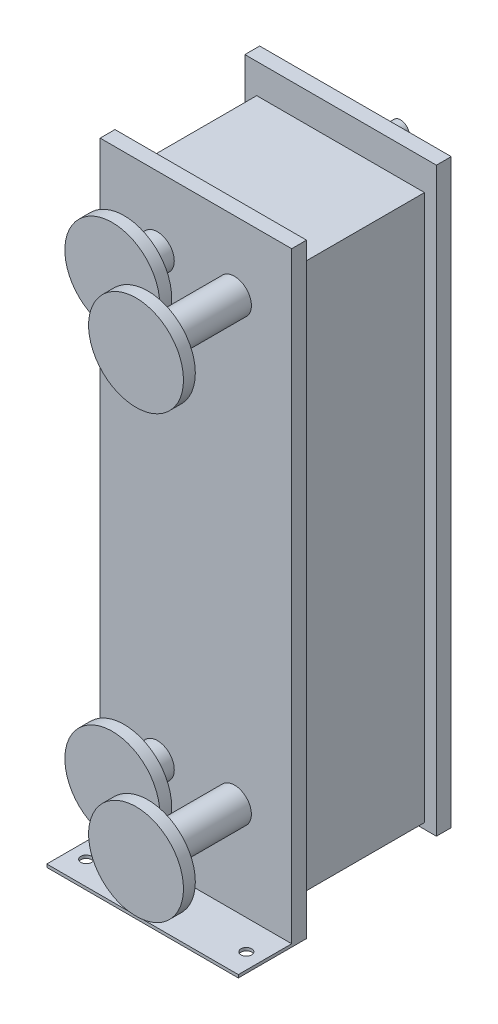
ISO-10303-21;
HEADER;
FILE_DESCRIPTION(('STEP AP214'),'2;1');
FILE_NAME('part.step','',(''),(''),'','','');
FILE_SCHEMA(('AUTOMOTIVE_DESIGN { 1 0 10303 214 1 1 1 1 }'));
ENDSEC;
DATA;
#1=APPLICATION_CONTEXT('core data for automotive mechanical design processes');
#2=APPLICATION_PROTOCOL_DEFINITION('international standard','automotive_design',2000,#1);
#3=PRODUCT_CONTEXT('',#1,'mechanical');
#4=PRODUCT('Part','Part','',(#3));
#5=PRODUCT_RELATED_PRODUCT_CATEGORY('part','',(#4));
#6=PRODUCT_DEFINITION_FORMATION('','',#4);
#7=PRODUCT_DEFINITION_CONTEXT('part definition',#1,'design');
#8=PRODUCT_DEFINITION('design','',#6,#7);
#9=PRODUCT_DEFINITION_SHAPE('','',#8);
#10=(LENGTH_UNIT() NAMED_UNIT(*) SI_UNIT(.MILLI.,.METRE.));
#11=(NAMED_UNIT(*) PLANE_ANGLE_UNIT() SI_UNIT($,.RADIAN.));
#12=(NAMED_UNIT(*) SI_UNIT($,.STERADIAN.) SOLID_ANGLE_UNIT());
#13=UNCERTAINTY_MEASURE_WITH_UNIT(LENGTH_MEASURE(1.E-05),#10,'distance_accuracy_value','');
#14=(GEOMETRIC_REPRESENTATION_CONTEXT(3) GLOBAL_UNCERTAINTY_ASSIGNED_CONTEXT((#13)) GLOBAL_UNIT_ASSIGNED_CONTEXT((#10,
#11,#12)) REPRESENTATION_CONTEXT('',''));
#15=CARTESIAN_POINT('',(0.,0.,0.));
#16=DIRECTION('',(0.,0.,1.));
#17=DIRECTION('',(1.,0.,0.));
#18=AXIS2_PLACEMENT_3D('',#15,#16,#17);
#19=CARTESIAN_POINT('',(65.0000000000001,-350.,101.));
#20=DIRECTION('',(0.,0.,-1.));
#21=DIRECTION('',(-1.,0.,0.));
#22=AXIS2_PLACEMENT_3D('',#19,#20,#21);
#23=CYLINDRICAL_SURFACE('',#22,28.5);
#24=CARTESIAN_POINT('',(65.0000000000001,-350.,25.));
#25=DIRECTION('',(0.,0.,1.));
#26=DIRECTION('',(1.,0.,0.));
#27=AXIS2_PLACEMENT_3D('',#24,#25,#26);
#28=CIRCLE('',#27,28.5);
#29=CARTESIAN_POINT('',(93.5000000000001,-350.,25.));
#30=VERTEX_POINT('',#29);
#31=EDGE_CURVE('E579',#30,#30,#28,.T.);
#32=ORIENTED_EDGE('',*,*,#31,.T.);
#33=EDGE_LOOP('',(#32));
#34=FACE_BOUND('',#33,.T.);
#35=CARTESIAN_POINT('',(65.0000000000001,-350.,171.));
#36=DIRECTION('',(0.,0.,1.));
#37=DIRECTION('',(1.,0.,0.));
#38=AXIS2_PLACEMENT_3D('',#35,#36,#37);
#39=CIRCLE('',#38,28.5);
#40=CARTESIAN_POINT('',(93.5000000000001,-350.,171.));
#41=VERTEX_POINT('',#40);
#42=EDGE_CURVE('E11',#41,#41,#39,.T.);
#43=ORIENTED_EDGE('',*,*,#42,.F.);
#44=EDGE_LOOP('',(#43));
#45=FACE_BOUND('',#44,.T.);
#46=ADVANCED_FACE('F36',(#34,#45),#23,.T.);
#47=CARTESIAN_POINT('',(65.,393.,101.));
#48=DIRECTION('',(0.,0.,-1.));
#49=DIRECTION('',(-1.,0.,0.));
#50=AXIS2_PLACEMENT_3D('',#47,#48,#49);
#51=CYLINDRICAL_SURFACE('',#50,28.5);
#52=CARTESIAN_POINT('',(65.,393.,25.));
#53=DIRECTION('',(0.,0.,1.));
#54=DIRECTION('',(1.,0.,0.));
#55=AXIS2_PLACEMENT_3D('',#52,#53,#54);
#56=CIRCLE('',#55,28.5);
#57=CARTESIAN_POINT('',(93.5,393.,25.));
#58=VERTEX_POINT('',#57);
#59=EDGE_CURVE('E578',#58,#58,#56,.T.);
#60=ORIENTED_EDGE('',*,*,#59,.T.);
#61=EDGE_LOOP('',(#60));
#62=FACE_BOUND('',#61,.T.);
#63=CARTESIAN_POINT('',(65.,393.,171.));
#64=DIRECTION('',(0.,0.,1.));
#65=DIRECTION('',(1.,0.,0.));
#66=AXIS2_PLACEMENT_3D('',#63,#64,#65);
#67=CIRCLE('',#66,28.5);
#68=CARTESIAN_POINT('',(93.5,393.,171.));
#69=VERTEX_POINT('',#68);
#70=EDGE_CURVE('E44',#69,#69,#67,.T.);
#71=ORIENTED_EDGE('',*,*,#70,.F.);
#72=EDGE_LOOP('',(#71));
#73=FACE_BOUND('',#72,.T.);
#74=ADVANCED_FACE('F302',(#62,#73),#51,.T.);
#75=CARTESIAN_POINT('',(-65.0000000000001,-350.,101.));
#76=DIRECTION('',(0.,0.,-1.));
#77=DIRECTION('',(-1.,0.,0.));
#78=AXIS2_PLACEMENT_3D('',#75,#76,#77);
#79=CYLINDRICAL_SURFACE('',#78,28.5);
#80=CARTESIAN_POINT('',(-65.0000000000001,-350.,25.));
#81=DIRECTION('',(0.,0.,1.));
#82=DIRECTION('',(1.,0.,0.));
#83=AXIS2_PLACEMENT_3D('',#80,#81,#82);
#84=CIRCLE('',#83,28.5);
#85=CARTESIAN_POINT('',(-36.5000000000001,-350.,25.));
#86=VERTEX_POINT('',#85);
#87=EDGE_CURVE('E590',#86,#86,#84,.T.);
#88=ORIENTED_EDGE('',*,*,#87,.T.);
#89=EDGE_LOOP('',(#88));
#90=FACE_BOUND('',#89,.T.);
#91=CARTESIAN_POINT('',(-65.0000000000001,-350.,81.));
#92=DIRECTION('',(0.,0.,1.));
#93=DIRECTION('',(1.,0.,0.));
#94=AXIS2_PLACEMENT_3D('',#91,#92,#93);
#95=CIRCLE('',#94,28.5);
#96=CARTESIAN_POINT('',(-36.5000000000001,-350.,81.));
#97=VERTEX_POINT('',#96);
#98=EDGE_CURVE('E294',#97,#97,#95,.T.);
#99=ORIENTED_EDGE('',*,*,#98,.F.);
#100=EDGE_LOOP('',(#99));
#101=FACE_BOUND('',#100,.T.);
#102=ADVANCED_FACE('F304',(#90,#101),#79,.T.);
#103=CARTESIAN_POINT('',(-65.,393.,101.));
#104=DIRECTION('',(0.,0.,-1.));
#105=DIRECTION('',(-1.,0.,0.));
#106=AXIS2_PLACEMENT_3D('',#103,#104,#105);
#107=CYLINDRICAL_SURFACE('',#106,28.5);
#108=CARTESIAN_POINT('',(-65.,393.,25.));
#109=DIRECTION('',(0.,0.,1.));
#110=DIRECTION('',(1.,0.,0.));
#111=AXIS2_PLACEMENT_3D('',#108,#109,#110);
#112=CIRCLE('',#111,28.5);
#113=CARTESIAN_POINT('',(-36.5,393.,25.));
#114=VERTEX_POINT('',#113);
#115=EDGE_CURVE('E576',#114,#114,#112,.T.);
#116=ORIENTED_EDGE('',*,*,#115,.T.);
#117=EDGE_LOOP('',(#116));
#118=FACE_BOUND('',#117,.T.);
#119=CARTESIAN_POINT('',(-65.,393.,81.));
#120=DIRECTION('',(0.,0.,1.));
#121=DIRECTION('',(1.,0.,0.));
#122=AXIS2_PLACEMENT_3D('',#119,#120,#121);
#123=CIRCLE('',#122,28.5);
#124=CARTESIAN_POINT('',(-36.5,393.,81.));
#125=VERTEX_POINT('',#124);
#126=EDGE_CURVE('E291',#125,#125,#123,.T.);
#127=ORIENTED_EDGE('',*,*,#126,.F.);
#128=EDGE_LOOP('',(#127));
#129=FACE_BOUND('',#128,.T.);
#130=ADVANCED_FACE('F311',(#118,#129),#107,.T.);
#131=CARTESIAN_POINT('',(161.5,-510.,25.));
#132=DIRECTION('',(0.,0.,1.));
#133=DIRECTION('',(1.,0.,0.));
#134=AXIS2_PLACEMENT_3D('',#131,#132,#133);
#135=PLANE('',#134);
#136=ORIENTED_EDGE('',*,*,#31,.F.);
#137=EDGE_LOOP('',(#136));
#138=FACE_BOUND('',#137,.T.);
#139=ORIENTED_EDGE('',*,*,#87,.F.);
#140=EDGE_LOOP('',(#139));
#141=FACE_BOUND('',#140,.T.);
#142=DIRECTION('',(0.,-1.,0.));
#143=VECTOR('',#142,1.);
#144=CARTESIAN_POINT('',(-161.5,510.,25.));
#145=LINE('',#144,#143);
#146=CARTESIAN_POINT('',(-161.5,510.,25.));
#147=VERTEX_POINT('',#146);
#148=CARTESIAN_POINT('',(-161.5,-505.,25.));
#149=VERTEX_POINT('',#148);
#150=EDGE_CURVE('E281',#147,#149,#145,.T.);
#151=ORIENTED_EDGE('',*,*,#150,.T.);
#152=DIRECTION('',(1.,0.,0.));
#153=VECTOR('',#152,1.);
#154=CARTESIAN_POINT('',(-161.5,-505.,25.));
#155=LINE('',#154,#153);
#156=CARTESIAN_POINT('',(161.5,-505.,25.));
#157=VERTEX_POINT('',#156);
#158=EDGE_CURVE('E277',#149,#157,#155,.T.);
#159=ORIENTED_EDGE('',*,*,#158,.T.);
#160=DIRECTION('',(0.,1.,0.));
#161=VECTOR('',#160,1.);
#162=CARTESIAN_POINT('',(161.5,510.,25.));
#163=LINE('',#162,#161);
#164=CARTESIAN_POINT('',(161.5,510.,25.));
#165=VERTEX_POINT('',#164);
#166=EDGE_CURVE('E477',#157,#165,#163,.T.);
#167=ORIENTED_EDGE('',*,*,#166,.T.);
#168=DIRECTION('',(-1.,0.,0.));
#169=VECTOR('',#168,1.);
#170=CARTESIAN_POINT('',(-161.5,510.,25.));
#171=LINE('',#170,#169);
#172=EDGE_CURVE('E486',#165,#147,#171,.T.);
#173=ORIENTED_EDGE('',*,*,#172,.T.);
#174=EDGE_LOOP('',(#151,#159,#167,#173));
#175=FACE_BOUND('',#174,.T.);
#176=ORIENTED_EDGE('',*,*,#115,.F.);
#177=EDGE_LOOP('',(#176));
#178=FACE_BOUND('',#177,.T.);
#179=ORIENTED_EDGE('',*,*,#59,.F.);
#180=EDGE_LOOP('',(#179));
#181=FACE_BOUND('',#180,.T.);
#182=ADVANCED_FACE('F328',(#138,#141,#175,#178,#181),#135,.T.);
#183=CARTESIAN_POINT('',(161.5,-470.,-244.));
#184=DIRECTION('',(0.,0.,-1.));
#185=DIRECTION('',(-1.,0.,0.));
#186=AXIS2_PLACEMENT_3D('',#183,#184,#185);
#187=PLANE('',#186);
#188=CARTESIAN_POINT('',(-1.12885274259759E-13,-420.,-244.));
#189=DIRECTION('',(0.,0.,-1.));
#190=DIRECTION('',(-1.,0.,0.));
#191=AXIS2_PLACEMENT_3D('',#188,#189,#190);
#192=CIRCLE('',#191,15.);
#193=CARTESIAN_POINT('',(-15.0000000000001,-420.,-244.));
#194=VERTEX_POINT('',#193);
#195=EDGE_CURVE('E253',#194,#194,#192,.T.);
#196=ORIENTED_EDGE('',*,*,#195,.F.);
#197=EDGE_LOOP('',(#196));
#198=FACE_BOUND('',#197,.T.);
#199=DIRECTION('',(0.,-1.,0.));
#200=VECTOR('',#199,1.);
#201=CARTESIAN_POINT('',(161.5,510.,-244.));
#202=LINE('',#201,#200);
#203=CARTESIAN_POINT('',(161.5,510.,-244.));
#204=VERTEX_POINT('',#203);
#205=CARTESIAN_POINT('',(161.5,-470.,-244.));
#206=VERTEX_POINT('',#205);
#207=EDGE_CURVE('E546',#204,#206,#202,.T.);
#208=ORIENTED_EDGE('',*,*,#207,.T.);
#209=DIRECTION('',(-1.,0.,0.));
#210=VECTOR('',#209,1.);
#211=CARTESIAN_POINT('',(161.5,-470.,-244.));
#212=LINE('',#211,#210);
#213=CARTESIAN_POINT('',(-161.5,-470.,-244.));
#214=VERTEX_POINT('',#213);
#215=EDGE_CURVE('E557',#206,#214,#212,.T.);
#216=ORIENTED_EDGE('',*,*,#215,.T.);
#217=DIRECTION('',(0.,1.,0.));
#218=VECTOR('',#217,1.);
#219=CARTESIAN_POINT('',(-161.5,510.,-244.));
#220=LINE('',#219,#218);
#221=CARTESIAN_POINT('',(-161.5,510.,-244.));
#222=VERTEX_POINT('',#221);
#223=EDGE_CURVE('E555',#214,#222,#220,.T.);
#224=ORIENTED_EDGE('',*,*,#223,.T.);
#225=DIRECTION('',(1.,0.,0.));
#226=VECTOR('',#225,1.);
#227=CARTESIAN_POINT('',(161.5,510.,-244.));
#228=LINE('',#227,#226);
#229=EDGE_CURVE('E543',#222,#204,#228,.T.);
#230=ORIENTED_EDGE('',*,*,#229,.T.);
#231=EDGE_LOOP('',(#208,#216,#224,#230));
#232=FACE_BOUND('',#231,.T.);
#233=CARTESIAN_POINT('',(0.,430.,-244.));
#234=DIRECTION('',(0.,0.,-1.));
#235=DIRECTION('',(-1.,0.,0.));
#236=AXIS2_PLACEMENT_3D('',#233,#234,#235);
#237=CIRCLE('',#236,15.);
#238=CARTESIAN_POINT('',(-15.,430.,-244.));
#239=VERTEX_POINT('',#238);
#240=EDGE_CURVE('E592',#239,#239,#237,.T.);
#241=ORIENTED_EDGE('',*,*,#240,.F.);
#242=EDGE_LOOP('',(#241));
#243=FACE_BOUND('',#242,.T.);
#244=ADVANCED_FACE('F396',(#198,#232,#243),#187,.T.);
#245=CARTESIAN_POINT('',(161.5,-510.,0.));
#246=DIRECTION('',(0.,0.,1.));
#247=DIRECTION('',(1.,0.,0.));
#248=AXIS2_PLACEMENT_3D('',#245,#246,#247);
#249=PLANE('',#248);
#250=DIRECTION('',(0.,1.,0.));
#251=VECTOR('',#250,1.);
#252=CARTESIAN_POINT('',(161.5,510.,0.));
#253=LINE('',#252,#251);
#254=CARTESIAN_POINT('',(161.5,-510.,0.));
#255=VERTEX_POINT('',#254);
#256=CARTESIAN_POINT('',(161.5,510.,0.));
#257=VERTEX_POINT('',#256);
#258=EDGE_CURVE('E468',#255,#257,#253,.T.);
#259=ORIENTED_EDGE('',*,*,#258,.F.);
#260=DIRECTION('',(1.,0.,0.));
#261=VECTOR('',#260,1.);
#262=CARTESIAN_POINT('',(-161.5,-510.,0.));
#263=LINE('',#262,#261);
#264=CARTESIAN_POINT('',(-161.5,-510.,0.));
#265=VERTEX_POINT('',#264);
#266=EDGE_CURVE('E475',#265,#255,#263,.T.);
#267=ORIENTED_EDGE('',*,*,#266,.F.);
#268=DIRECTION('',(0.,-1.,0.));
#269=VECTOR('',#268,1.);
#270=CARTESIAN_POINT('',(-161.5,510.,0.));
#271=LINE('',#270,#269);
#272=CARTESIAN_POINT('',(-161.5,510.,0.));
#273=VERTEX_POINT('',#272);
#274=EDGE_CURVE('E467',#273,#265,#271,.T.);
#275=ORIENTED_EDGE('',*,*,#274,.F.);
#276=DIRECTION('',(-1.,0.,0.));
#277=VECTOR('',#276,1.);
#278=CARTESIAN_POINT('',(-161.5,510.,0.));
#279=LINE('',#278,#277);
#280=EDGE_CURVE('E458',#257,#273,#279,.T.);
#281=ORIENTED_EDGE('',*,*,#280,.F.);
#282=EDGE_LOOP('',(#259,#267,#275,#281));
#283=FACE_BOUND('',#282,.T.);
#284=DIRECTION('',(0.,-1.,0.));
#285=VECTOR('',#284,1.);
#286=CARTESIAN_POINT('',(141.5,460.,0.));
#287=LINE('',#286,#285);
#288=CARTESIAN_POINT('',(141.5,460.,0.));
#289=VERTEX_POINT('',#288);
#290=CARTESIAN_POINT('',(141.5,-460.,0.));
#291=VERTEX_POINT('',#290);
#292=EDGE_CURVE('E503',#289,#291,#287,.T.);
#293=ORIENTED_EDGE('',*,*,#292,.F.);
#294=DIRECTION('',(1.,0.,0.));
#295=VECTOR('',#294,1.);
#296=CARTESIAN_POINT('',(-141.5,460.,0.));
#297=LINE('',#296,#295);
#298=CARTESIAN_POINT('',(-141.5,460.,0.));
#299=VERTEX_POINT('',#298);
#300=EDGE_CURVE('E510',#299,#289,#297,.T.);
#301=ORIENTED_EDGE('',*,*,#300,.F.);
#302=DIRECTION('',(0.,1.,0.));
#303=VECTOR('',#302,1.);
#304=CARTESIAN_POINT('',(-141.5,460.,0.));
#305=LINE('',#304,#303);
#306=CARTESIAN_POINT('',(-141.5,-460.,0.));
#307=VERTEX_POINT('',#306);
#308=EDGE_CURVE('E515',#307,#299,#305,.T.);
#309=ORIENTED_EDGE('',*,*,#308,.F.);
#310=DIRECTION('',(-1.,0.,0.));
#311=VECTOR('',#310,1.);
#312=CARTESIAN_POINT('',(-141.5,-460.,0.));
#313=LINE('',#312,#311);
#314=EDGE_CURVE('E59',#291,#307,#313,.T.);
#315=ORIENTED_EDGE('',*,*,#314,.F.);
#316=EDGE_LOOP('',(#293,#301,#309,#315));
#317=FACE_BOUND('',#316,.T.);
#318=ADVANCED_FACE('F399',(#283,#317),#249,.F.);
#319=CARTESIAN_POINT('',(161.5,510.,25.));
#320=DIRECTION('',(-1.,0.,0.));
#321=DIRECTION('',(0.,-1.,0.));
#322=AXIS2_PLACEMENT_3D('',#319,#320,#321);
#323=PLANE('',#322);
#324=ORIENTED_EDGE('',*,*,#258,.T.);
#325=DIRECTION('',(0.,0.,-1.));
#326=VECTOR('',#325,1.);
#327=CARTESIAN_POINT('',(161.5,510.,25.));
#328=LINE('',#327,#326);
#329=EDGE_CURVE('E295',#165,#257,#328,.T.);
#330=ORIENTED_EDGE('',*,*,#329,.F.);
#331=ORIENTED_EDGE('',*,*,#166,.F.);
#332=DIRECTION('',(0.,0.,1.));
#333=VECTOR('',#332,1.);
#334=CARTESIAN_POINT('',(161.5,-505.,25.));
#335=LINE('',#334,#333);
#336=CARTESIAN_POINT('',(161.5,-505.,115.));
#337=VERTEX_POINT('',#336);
#338=EDGE_CURVE('E51',#157,#337,#335,.T.);
#339=ORIENTED_EDGE('',*,*,#338,.T.);
#340=DIRECTION('',(0.,-1.,0.));
#341=VECTOR('',#340,1.);
#342=CARTESIAN_POINT('',(161.5,-505.,115.));
#343=LINE('',#342,#341);
#344=CARTESIAN_POINT('',(161.5,-510.,115.));
#345=VERTEX_POINT('',#344);
#346=EDGE_CURVE('E561',#337,#345,#343,.T.);
#347=ORIENTED_EDGE('',*,*,#346,.T.);
#348=DIRECTION('',(0.,0.,-1.));
#349=VECTOR('',#348,1.);
#350=CARTESIAN_POINT('',(161.5,-510.,25.));
#351=LINE('',#350,#349);
#352=EDGE_CURVE('E481',#345,#255,#351,.T.);
#353=ORIENTED_EDGE('',*,*,#352,.T.);
#354=EDGE_LOOP('',(#324,#330,#331,#339,#347,#353));
#355=FACE_BOUND('',#354,.T.);
#356=ADVANCED_FACE('F38',(#355),#323,.F.);
#357=CARTESIAN_POINT('',(-161.5,510.,25.));
#358=DIRECTION('',(0.,-1.,0.));
#359=DIRECTION('',(0.,0.,-1.));
#360=AXIS2_PLACEMENT_3D('',#357,#358,#359);
#361=PLANE('',#360);
#362=ORIENTED_EDGE('',*,*,#280,.T.);
#363=DIRECTION('',(0.,0.,-1.));
#364=VECTOR('',#363,1.);
#365=CARTESIAN_POINT('',(-161.5,510.,25.));
#366=LINE('',#365,#364);
#367=EDGE_CURVE('E461',#147,#273,#366,.T.);
#368=ORIENTED_EDGE('',*,*,#367,.F.);
#369=ORIENTED_EDGE('',*,*,#172,.F.);
#370=ORIENTED_EDGE('',*,*,#329,.T.);
#371=EDGE_LOOP('',(#362,#368,#369,#370));
#372=FACE_BOUND('',#371,.T.);
#373=ADVANCED_FACE('F448',(#372),#361,.F.);
#374=CARTESIAN_POINT('',(-161.5,510.,25.));
#375=DIRECTION('',(1.,0.,0.));
#376=DIRECTION('',(0.,1.,0.));
#377=AXIS2_PLACEMENT_3D('',#374,#375,#376);
#378=PLANE('',#377);
#379=ORIENTED_EDGE('',*,*,#274,.T.);
#380=DIRECTION('',(0.,0.,-1.));
#381=VECTOR('',#380,1.);
#382=CARTESIAN_POINT('',(-161.5,-510.,25.));
#383=LINE('',#382,#381);
#384=CARTESIAN_POINT('',(-161.5,-510.,115.));
#385=VERTEX_POINT('',#384);
#386=EDGE_CURVE('E472',#385,#265,#383,.T.);
#387=ORIENTED_EDGE('',*,*,#386,.F.);
#388=DIRECTION('',(0.,-1.,0.));
#389=VECTOR('',#388,1.);
#390=CARTESIAN_POINT('',(-161.5,-505.,115.));
#391=LINE('',#390,#389);
#392=CARTESIAN_POINT('',(-161.5,-505.,115.));
#393=VERTEX_POINT('',#392);
#394=EDGE_CURVE('E553',#393,#385,#391,.T.);
#395=ORIENTED_EDGE('',*,*,#394,.F.);
#396=DIRECTION('',(0.,0.,-1.));
#397=VECTOR('',#396,1.);
#398=CARTESIAN_POINT('',(-161.5,-505.,25.));
#399=LINE('',#398,#397);
#400=EDGE_CURVE('E280',#393,#149,#399,.T.);
#401=ORIENTED_EDGE('',*,*,#400,.T.);
#402=ORIENTED_EDGE('',*,*,#150,.F.);
#403=ORIENTED_EDGE('',*,*,#367,.T.);
#404=EDGE_LOOP('',(#379,#387,#395,#401,#402,#403));
#405=FACE_BOUND('',#404,.T.);
#406=ADVANCED_FACE('F445',(#405),#378,.F.);
#407=CARTESIAN_POINT('',(-161.5,-510.,25.));
#408=DIRECTION('',(0.,1.,0.));
#409=DIRECTION('',(0.,0.,1.));
#410=AXIS2_PLACEMENT_3D('',#407,#408,#409);
#411=PLANE('',#410);
#412=ORIENTED_EDGE('',*,*,#266,.T.);
#413=ORIENTED_EDGE('',*,*,#352,.F.);
#414=DIRECTION('',(-1.,0.,0.));
#415=VECTOR('',#414,1.);
#416=CARTESIAN_POINT('',(-161.5,-510.,115.));
#417=LINE('',#416,#415);
#418=EDGE_CURVE('E269',#345,#385,#417,.T.);
#419=ORIENTED_EDGE('',*,*,#418,.T.);
#420=ORIENTED_EDGE('',*,*,#386,.T.);
#421=EDGE_LOOP('',(#412,#413,#419,#420));
#422=FACE_BOUND('',#421,.T.);
#423=CARTESIAN_POINT('',(135.,-510.,75.));
#424=DIRECTION('',(0.,-1.,0.));
#425=DIRECTION('',(0.,0.,-1.));
#426=AXIS2_PLACEMENT_3D('',#423,#424,#425);
#427=CIRCLE('',#426,9.00000000000001);
#428=CARTESIAN_POINT('',(135.,-510.,66.));
#429=VERTEX_POINT('',#428);
#430=EDGE_CURVE('E259',#429,#429,#427,.T.);
#431=ORIENTED_EDGE('',*,*,#430,.F.);
#432=EDGE_LOOP('',(#431));
#433=FACE_BOUND('',#432,.T.);
#434=CARTESIAN_POINT('',(-135.,-510.,75.));
#435=DIRECTION('',(0.,-1.,0.));
#436=DIRECTION('',(0.,0.,-1.));
#437=AXIS2_PLACEMENT_3D('',#434,#435,#436);
#438=CIRCLE('',#437,9.00000000000001);
#439=CARTESIAN_POINT('',(-135.,-510.,66.));
#440=VERTEX_POINT('',#439);
#441=EDGE_CURVE('E263',#440,#440,#438,.T.);
#442=ORIENTED_EDGE('',*,*,#441,.F.);
#443=EDGE_LOOP('',(#442));
#444=FACE_BOUND('',#443,.T.);
#445=ADVANCED_FACE('F435',(#422,#433,#444),#411,.F.);
#446=CARTESIAN_POINT('',(141.5,460.,-1181.54298605309));
#447=DIRECTION('',(-1.,0.,0.));
#448=DIRECTION('',(0.,0.,1.));
#449=AXIS2_PLACEMENT_3D('',#446,#447,#448);
#450=PLANE('',#449);
#451=DIRECTION('',(0.,-1.,0.));
#452=VECTOR('',#451,1.);
#453=CARTESIAN_POINT('',(141.5,460.,-219.));
#454=LINE('',#453,#452);
#455=CARTESIAN_POINT('',(141.5,460.,-219.));
#456=VERTEX_POINT('',#455);
#457=CARTESIAN_POINT('',(141.5,-460.,-219.));
#458=VERTEX_POINT('',#457);
#459=EDGE_CURVE('E500',#456,#458,#454,.T.);
#460=ORIENTED_EDGE('',*,*,#459,.F.);
#461=DIRECTION('',(0.,0.,1.));
#462=VECTOR('',#461,1.);
#463=CARTESIAN_POINT('',(141.5,460.,-1181.54298605309));
#464=LINE('',#463,#462);
#465=EDGE_CURVE('E490',#456,#289,#464,.T.);
#466=ORIENTED_EDGE('',*,*,#465,.T.);
#467=ORIENTED_EDGE('',*,*,#292,.T.);
#468=DIRECTION('',(0.,0.,1.));
#469=VECTOR('',#468,1.);
#470=CARTESIAN_POINT('',(141.5,-460.,-1181.54298605309));
#471=LINE('',#470,#469);
#472=EDGE_CURVE('E511',#458,#291,#471,.T.);
#473=ORIENTED_EDGE('',*,*,#472,.F.);
#474=EDGE_LOOP('',(#460,#466,#467,#473));
#475=FACE_BOUND('',#474,.T.);
#476=ADVANCED_FACE('F431',(#475),#450,.F.);
#477=CARTESIAN_POINT('',(-141.5,-460.,-1181.54298605309));
#478=DIRECTION('',(0.,1.,0.));
#479=DIRECTION('',(0.,0.,1.));
#480=AXIS2_PLACEMENT_3D('',#477,#478,#479);
#481=PLANE('',#480);
#482=DIRECTION('',(-1.,0.,0.));
#483=VECTOR('',#482,1.);
#484=CARTESIAN_POINT('',(-141.5,-460.,-219.));
#485=LINE('',#484,#483);
#486=CARTESIAN_POINT('',(-141.5,-460.,-219.));
#487=VERTEX_POINT('',#486);
#488=EDGE_CURVE('E495',#458,#487,#485,.T.);
#489=ORIENTED_EDGE('',*,*,#488,.F.);
#490=ORIENTED_EDGE('',*,*,#472,.T.);
#491=ORIENTED_EDGE('',*,*,#314,.T.);
#492=DIRECTION('',(0.,0.,1.));
#493=VECTOR('',#492,1.);
#494=CARTESIAN_POINT('',(-141.5,-460.,-1181.54298605309));
#495=LINE('',#494,#493);
#496=EDGE_CURVE('E513',#487,#307,#495,.T.);
#497=ORIENTED_EDGE('',*,*,#496,.F.);
#498=EDGE_LOOP('',(#489,#490,#491,#497));
#499=FACE_BOUND('',#498,.T.);
#500=ADVANCED_FACE('F427',(#499),#481,.F.);
#501=CARTESIAN_POINT('',(-141.5,460.,-1181.54298605309));
#502=DIRECTION('',(1.,0.,0.));
#503=DIRECTION('',(0.,0.,-1.));
#504=AXIS2_PLACEMENT_3D('',#501,#502,#503);
#505=PLANE('',#504);
#506=DIRECTION('',(0.,1.,0.));
#507=VECTOR('',#506,1.);
#508=CARTESIAN_POINT('',(-141.5,460.,-219.));
#509=LINE('',#508,#507);
#510=CARTESIAN_POINT('',(-141.5,460.,-219.));
#511=VERTEX_POINT('',#510);
#512=EDGE_CURVE('E493',#487,#511,#509,.T.);
#513=ORIENTED_EDGE('',*,*,#512,.F.);
#514=ORIENTED_EDGE('',*,*,#496,.T.);
#515=ORIENTED_EDGE('',*,*,#308,.T.);
#516=DIRECTION('',(0.,0.,1.));
#517=VECTOR('',#516,1.);
#518=CARTESIAN_POINT('',(-141.5,460.,-1181.54298605309));
#519=LINE('',#518,#517);
#520=EDGE_CURVE('E516',#511,#299,#519,.T.);
#521=ORIENTED_EDGE('',*,*,#520,.F.);
#522=EDGE_LOOP('',(#513,#514,#515,#521));
#523=FACE_BOUND('',#522,.T.);
#524=ADVANCED_FACE('F423',(#523),#505,.F.);
#525=CARTESIAN_POINT('',(-141.5,460.,-1181.54298605309));
#526=DIRECTION('',(0.,-1.,0.));
#527=DIRECTION('',(0.,0.,-1.));
#528=AXIS2_PLACEMENT_3D('',#525,#526,#527);
#529=PLANE('',#528);
#530=DIRECTION('',(1.,0.,0.));
#531=VECTOR('',#530,1.);
#532=CARTESIAN_POINT('',(-141.5,460.,-219.));
#533=LINE('',#532,#531);
#534=EDGE_CURVE('E508',#511,#456,#533,.T.);
#535=ORIENTED_EDGE('',*,*,#534,.F.);
#536=ORIENTED_EDGE('',*,*,#520,.T.);
#537=ORIENTED_EDGE('',*,*,#300,.T.);
#538=ORIENTED_EDGE('',*,*,#465,.F.);
#539=EDGE_LOOP('',(#535,#536,#537,#538));
#540=FACE_BOUND('',#539,.T.);
#541=ADVANCED_FACE('F405',(#540),#529,.F.);
#542=CARTESIAN_POINT('',(161.5,-470.,-219.));
#543=DIRECTION('',(0.,0.,-1.));
#544=DIRECTION('',(-1.,0.,0.));
#545=AXIS2_PLACEMENT_3D('',#542,#543,#544);
#546=PLANE('',#545);
#547=DIRECTION('',(0.,-1.,0.));
#548=VECTOR('',#547,1.);
#549=CARTESIAN_POINT('',(161.5,510.,-219.));
#550=LINE('',#549,#548);
#551=CARTESIAN_POINT('',(161.5,510.,-219.));
#552=VERTEX_POINT('',#551);
#553=CARTESIAN_POINT('',(161.5,-470.,-219.));
#554=VERTEX_POINT('',#553);
#555=EDGE_CURVE('E551',#552,#554,#550,.T.);
#556=ORIENTED_EDGE('',*,*,#555,.F.);
#557=DIRECTION('',(1.,0.,0.));
#558=VECTOR('',#557,1.);
#559=CARTESIAN_POINT('',(161.5,510.,-219.));
#560=LINE('',#559,#558);
#561=CARTESIAN_POINT('',(-161.5,510.,-219.));
#562=VERTEX_POINT('',#561);
#563=EDGE_CURVE('E544',#562,#552,#560,.T.);
#564=ORIENTED_EDGE('',*,*,#563,.F.);
#565=DIRECTION('',(0.,1.,0.));
#566=VECTOR('',#565,1.);
#567=CARTESIAN_POINT('',(-161.5,510.,-219.));
#568=LINE('',#567,#566);
#569=CARTESIAN_POINT('',(-161.5,-470.,-219.));
#570=VERTEX_POINT('',#569);
#571=EDGE_CURVE('E547',#570,#562,#568,.T.);
#572=ORIENTED_EDGE('',*,*,#571,.F.);
#573=DIRECTION('',(-1.,0.,0.));
#574=VECTOR('',#573,1.);
#575=CARTESIAN_POINT('',(161.5,-470.,-219.));
#576=LINE('',#575,#574);
#577=EDGE_CURVE('E549',#554,#570,#576,.T.);
#578=ORIENTED_EDGE('',*,*,#577,.F.);
#579=EDGE_LOOP('',(#556,#564,#572,#578));
#580=FACE_BOUND('',#579,.T.);
#581=ORIENTED_EDGE('',*,*,#534,.T.);
#582=ORIENTED_EDGE('',*,*,#459,.T.);
#583=ORIENTED_EDGE('',*,*,#488,.T.);
#584=ORIENTED_EDGE('',*,*,#512,.T.);
#585=EDGE_LOOP('',(#581,#582,#583,#584));
#586=FACE_BOUND('',#585,.T.);
#587=ADVANCED_FACE('F401',(#580,#586),#546,.F.);
#588=CARTESIAN_POINT('',(161.5,510.,-244.));
#589=DIRECTION('',(-1.,0.,0.));
#590=DIRECTION('',(0.,-1.,0.));
#591=AXIS2_PLACEMENT_3D('',#588,#589,#590);
#592=PLANE('',#591);
#593=ORIENTED_EDGE('',*,*,#555,.T.);
#594=DIRECTION('',(0.,0.,1.));
#595=VECTOR('',#594,1.);
#596=CARTESIAN_POINT('',(161.5,-470.,-244.));
#597=LINE('',#596,#595);
#598=EDGE_CURVE('E529',#206,#554,#597,.T.);
#599=ORIENTED_EDGE('',*,*,#598,.F.);
#600=ORIENTED_EDGE('',*,*,#207,.F.);
#601=DIRECTION('',(0.,0.,1.));
#602=VECTOR('',#601,1.);
#603=CARTESIAN_POINT('',(161.5,510.,-244.));
#604=LINE('',#603,#602);
#605=EDGE_CURVE('E540',#204,#552,#604,.T.);
#606=ORIENTED_EDGE('',*,*,#605,.T.);
#607=EDGE_LOOP('',(#593,#599,#600,#606));
#608=FACE_BOUND('',#607,.T.);
#609=ADVANCED_FACE('F404',(#608),#592,.F.);
#610=CARTESIAN_POINT('',(161.5,-470.,-244.));
#611=DIRECTION('',(0.,1.,0.));
#612=DIRECTION('',(-1.,0.,0.));
#613=AXIS2_PLACEMENT_3D('',#610,#611,#612);
#614=PLANE('',#613);
#615=ORIENTED_EDGE('',*,*,#577,.T.);
#616=DIRECTION('',(0.,0.,1.));
#617=VECTOR('',#616,1.);
#618=CARTESIAN_POINT('',(-161.5,-470.,-244.));
#619=LINE('',#618,#617);
#620=EDGE_CURVE('E531',#214,#570,#619,.T.);
#621=ORIENTED_EDGE('',*,*,#620,.F.);
#622=ORIENTED_EDGE('',*,*,#215,.F.);
#623=ORIENTED_EDGE('',*,*,#598,.T.);
#624=EDGE_LOOP('',(#615,#621,#622,#623));
#625=FACE_BOUND('',#624,.T.);
#626=ADVANCED_FACE('F413',(#625),#614,.F.);
#627=CARTESIAN_POINT('',(-161.5,510.,-244.));
#628=DIRECTION('',(1.,0.,0.));
#629=DIRECTION('',(0.,1.,0.));
#630=AXIS2_PLACEMENT_3D('',#627,#628,#629);
#631=PLANE('',#630);
#632=ORIENTED_EDGE('',*,*,#571,.T.);
#633=DIRECTION('',(0.,0.,1.));
#634=VECTOR('',#633,1.);
#635=CARTESIAN_POINT('',(-161.5,510.,-244.));
#636=LINE('',#635,#634);
#637=EDGE_CURVE('E535',#222,#562,#636,.T.);
#638=ORIENTED_EDGE('',*,*,#637,.F.);
#639=ORIENTED_EDGE('',*,*,#223,.F.);
#640=ORIENTED_EDGE('',*,*,#620,.T.);
#641=EDGE_LOOP('',(#632,#638,#639,#640));
#642=FACE_BOUND('',#641,.T.);
#643=ADVANCED_FACE('F409',(#642),#631,.F.);
#644=CARTESIAN_POINT('',(161.5,510.,-244.));
#645=DIRECTION('',(0.,-1.,0.));
#646=DIRECTION('',(0.,0.,-1.));
#647=AXIS2_PLACEMENT_3D('',#644,#645,#646);
#648=PLANE('',#647);
#649=ORIENTED_EDGE('',*,*,#563,.T.);
#650=ORIENTED_EDGE('',*,*,#605,.F.);
#651=ORIENTED_EDGE('',*,*,#229,.F.);
#652=ORIENTED_EDGE('',*,*,#637,.T.);
#653=EDGE_LOOP('',(#649,#650,#651,#652));
#654=FACE_BOUND('',#653,.T.);
#655=ADVANCED_FACE('F394',(#654),#648,.F.);
#656=CARTESIAN_POINT('',(-161.5,-505.,115.));
#657=DIRECTION('',(0.,0.,1.));
#658=DIRECTION('',(1.,0.,0.));
#659=AXIS2_PLACEMENT_3D('',#656,#657,#658);
#660=PLANE('',#659);
#661=ORIENTED_EDGE('',*,*,#418,.F.);
#662=ORIENTED_EDGE('',*,*,#346,.F.);
#663=DIRECTION('',(-1.,0.,0.));
#664=VECTOR('',#663,1.);
#665=CARTESIAN_POINT('',(-161.5,-505.,115.));
#666=LINE('',#665,#664);
#667=EDGE_CURVE('E274',#337,#393,#666,.T.);
#668=ORIENTED_EDGE('',*,*,#667,.T.);
#669=ORIENTED_EDGE('',*,*,#394,.T.);
#670=EDGE_LOOP('',(#661,#662,#668,#669));
#671=FACE_BOUND('',#670,.T.);
#672=ADVANCED_FACE('F390',(#671),#660,.T.);
#673=CARTESIAN_POINT('',(-161.5,-505.,115.));
#674=DIRECTION('',(0.,1.,0.));
#675=DIRECTION('',(0.,0.,1.));
#676=AXIS2_PLACEMENT_3D('',#673,#674,#675);
#677=PLANE('',#676);
#678=CARTESIAN_POINT('',(135.,-505.,75.));
#679=DIRECTION('',(0.,-1.,0.));
#680=DIRECTION('',(0.,0.,-1.));
#681=AXIS2_PLACEMENT_3D('',#678,#679,#680);
#682=CIRCLE('',#681,9.00000000000001);
#683=CARTESIAN_POINT('',(135.,-505.,66.));
#684=VERTEX_POINT('',#683);
#685=EDGE_CURVE('E260',#684,#684,#682,.T.);
#686=ORIENTED_EDGE('',*,*,#685,.T.);
#687=EDGE_LOOP('',(#686));
#688=FACE_BOUND('',#687,.T.);
#689=CARTESIAN_POINT('',(-135.,-505.,75.));
#690=DIRECTION('',(0.,-1.,0.));
#691=DIRECTION('',(0.,0.,-1.));
#692=AXIS2_PLACEMENT_3D('',#689,#690,#691);
#693=CIRCLE('',#692,9.00000000000001);
#694=CARTESIAN_POINT('',(-135.,-505.,66.));
#695=VERTEX_POINT('',#694);
#696=EDGE_CURVE('E266',#695,#695,#693,.T.);
#697=ORIENTED_EDGE('',*,*,#696,.T.);
#698=EDGE_LOOP('',(#697));
#699=FACE_BOUND('',#698,.T.);
#700=ORIENTED_EDGE('',*,*,#400,.F.);
#701=ORIENTED_EDGE('',*,*,#667,.F.);
#702=ORIENTED_EDGE('',*,*,#338,.F.);
#703=ORIENTED_EDGE('',*,*,#158,.F.);
#704=EDGE_LOOP('',(#700,#701,#702,#703));
#705=FACE_BOUND('',#704,.T.);
#706=ADVANCED_FACE('F386',(#688,#699,#705),#677,.T.);
#707=CARTESIAN_POINT('',(-135.,-505.,75.));
#708=DIRECTION('',(0.,-1.,0.));
#709=DIRECTION('',(0.,0.,-1.));
#710=AXIS2_PLACEMENT_3D('',#707,#708,#709);
#711=CYLINDRICAL_SURFACE('',#710,9.00000000000001);
#712=ORIENTED_EDGE('',*,*,#696,.F.);
#713=EDGE_LOOP('',(#712));
#714=FACE_BOUND('',#713,.T.);
#715=ORIENTED_EDGE('',*,*,#441,.T.);
#716=EDGE_LOOP('',(#715));
#717=FACE_BOUND('',#716,.T.);
#718=ADVANCED_FACE('F382',(#714,#717),#711,.F.);
#719=CARTESIAN_POINT('',(135.,-505.,75.));
#720=DIRECTION('',(0.,-1.,0.));
#721=DIRECTION('',(0.,0.,-1.));
#722=AXIS2_PLACEMENT_3D('',#719,#720,#721);
#723=CYLINDRICAL_SURFACE('',#722,9.00000000000001);
#724=ORIENTED_EDGE('',*,*,#685,.F.);
#725=EDGE_LOOP('',(#724));
#726=FACE_BOUND('',#725,.T.);
#727=ORIENTED_EDGE('',*,*,#430,.T.);
#728=EDGE_LOOP('',(#727));
#729=FACE_BOUND('',#728,.T.);
#730=ADVANCED_FACE('F378',(#726,#729),#723,.F.);
#731=CARTESIAN_POINT('',(-1.12885274259759E-13,-420.,-362.426406871193));
#732=DIRECTION('',(0.,0.,1.));
#733=DIRECTION('',(1.,0.,0.));
#734=AXIS2_PLACEMENT_3D('',#731,#732,#733);
#735=CYLINDRICAL_SURFACE('',#734,15.);
#736=ORIENTED_EDGE('',*,*,#195,.T.);
#737=EDGE_LOOP('',(#736));
#738=FACE_BOUND('',#737,.T.);
#739=CARTESIAN_POINT('',(-1.12885274259759E-13,-420.,-320.));
#740=DIRECTION('',(0.,0.,-1.));
#741=DIRECTION('',(-1.,0.,0.));
#742=AXIS2_PLACEMENT_3D('',#739,#740,#741);
#743=CIRCLE('',#742,15.);
#744=CARTESIAN_POINT('',(-1.14491749414469E-13,-405.,-320.));
#745=VERTEX_POINT('',#744);
#746=EDGE_CURVE('E256',#745,#745,#743,.T.);
#747=ORIENTED_EDGE('',*,*,#746,.F.);
#748=EDGE_LOOP('',(#747));
#749=FACE_BOUND('',#748,.T.);
#750=ADVANCED_FACE('F347',(#738,#749),#735,.T.);
#751=CARTESIAN_POINT('',(-17.,-405.,-320.));
#752=DIRECTION('',(0.,0.,-1.));
#753=DIRECTION('',(-1.,0.,0.));
#754=AXIS2_PLACEMENT_3D('',#751,#752,#753);
#755=PLANE('',#754);
#756=DIRECTION('',(-1.,0.,0.));
#757=VECTOR('',#756,1.);
#758=CARTESIAN_POINT('',(-17.,-405.,-320.));
#759=LINE('',#758,#757);
#760=CARTESIAN_POINT('',(17.,-405.,-320.));
#761=VERTEX_POINT('',#760);
#762=EDGE_CURVE('E215',#761,#745,#759,.T.);
#763=ORIENTED_EDGE('',*,*,#762,.T.);
#764=ORIENTED_EDGE('',*,*,#746,.T.);
#765=CARTESIAN_POINT('',(-17.,-405.,-320.));
#766=VERTEX_POINT('',#765);
#767=EDGE_CURVE('E204',#745,#766,#759,.T.);
#768=ORIENTED_EDGE('',*,*,#767,.T.);
#769=DIRECTION('',(0.,-1.,0.));
#770=VECTOR('',#769,1.);
#771=CARTESIAN_POINT('',(-17.,-510.,-320.));
#772=LINE('',#771,#770);
#773=CARTESIAN_POINT('',(-17.,-510.,-320.));
#774=VERTEX_POINT('',#773);
#775=EDGE_CURVE('E182',#766,#774,#772,.T.);
#776=ORIENTED_EDGE('',*,*,#775,.T.);
#777=DIRECTION('',(1.,0.,0.));
#778=VECTOR('',#777,1.);
#779=CARTESIAN_POINT('',(-17.,-510.,-320.));
#780=LINE('',#779,#778);
#781=CARTESIAN_POINT('',(17.,-510.,-320.));
#782=VERTEX_POINT('',#781);
#783=EDGE_CURVE('E192',#774,#782,#780,.T.);
#784=ORIENTED_EDGE('',*,*,#783,.T.);
#785=DIRECTION('',(0.,1.,0.));
#786=VECTOR('',#785,1.);
#787=CARTESIAN_POINT('',(17.,-510.,-320.));
#788=LINE('',#787,#786);
#789=EDGE_CURVE('E198',#782,#761,#788,.T.);
#790=ORIENTED_EDGE('',*,*,#789,.T.);
#791=EDGE_LOOP('',(#763,#764,#768,#776,#784,#790));
#792=FACE_BOUND('',#791,.T.);
#793=ADVANCED_FACE('F201',(#792),#755,.F.);
#794=CARTESIAN_POINT('',(-17.,-505.,-380.));
#795=DIRECTION('',(-1.,0.,0.));
#796=DIRECTION('',(0.,0.,1.));
#797=AXIS2_PLACEMENT_3D('',#794,#795,#796);
#798=PLANE('',#797);
#799=DIRECTION('',(0.,0.,-1.));
#800=VECTOR('',#799,1.);
#801=CARTESIAN_POINT('',(-17.,-510.,-380.));
#802=LINE('',#801,#800);
#803=CARTESIAN_POINT('',(-17.,-510.,-380.));
#804=VERTEX_POINT('',#803);
#805=EDGE_CURVE('E177',#774,#804,#802,.T.);
#806=ORIENTED_EDGE('',*,*,#805,.F.);
#807=ORIENTED_EDGE('',*,*,#775,.F.);
#808=DIRECTION('',(0.,0.,-1.));
#809=VECTOR('',#808,1.);
#810=CARTESIAN_POINT('',(-17.,-405.,-320.));
#811=LINE('',#810,#809);
#812=CARTESIAN_POINT('',(-17.,-405.,-330.));
#813=VERTEX_POINT('',#812);
#814=EDGE_CURVE('E217',#766,#813,#811,.T.);
#815=ORIENTED_EDGE('',*,*,#814,.T.);
#816=DIRECTION('',(0.,-1.,0.));
#817=VECTOR('',#816,1.);
#818=CARTESIAN_POINT('',(-17.,-510.,-330.));
#819=LINE('',#818,#817);
#820=CARTESIAN_POINT('',(-17.,-505.,-330.));
#821=VERTEX_POINT('',#820);
#822=EDGE_CURVE('E222',#813,#821,#819,.T.);
#823=ORIENTED_EDGE('',*,*,#822,.T.);
#824=DIRECTION('',(0.,0.,-1.));
#825=VECTOR('',#824,1.);
#826=CARTESIAN_POINT('',(-17.,-505.,-380.));
#827=LINE('',#826,#825);
#828=CARTESIAN_POINT('',(-17.,-505.,-380.));
#829=VERTEX_POINT('',#828);
#830=EDGE_CURVE('E238',#821,#829,#827,.T.);
#831=ORIENTED_EDGE('',*,*,#830,.T.);
#832=DIRECTION('',(0.,-1.,0.));
#833=VECTOR('',#832,1.);
#834=CARTESIAN_POINT('',(-17.,-505.,-380.));
#835=LINE('',#834,#833);
#836=EDGE_CURVE('E184',#829,#804,#835,.T.);
#837=ORIENTED_EDGE('',*,*,#836,.T.);
#838=EDGE_LOOP('',(#806,#807,#815,#823,#831,#837));
#839=FACE_BOUND('',#838,.T.);
#840=ADVANCED_FACE('F179',(#839),#798,.T.);
#841=CARTESIAN_POINT('',(17.,-505.,-380.));
#842=DIRECTION('',(1.,0.,0.));
#843=DIRECTION('',(0.,0.,-1.));
#844=AXIS2_PLACEMENT_3D('',#841,#842,#843);
#845=PLANE('',#844);
#846=DIRECTION('',(0.,0.,1.));
#847=VECTOR('',#846,1.);
#848=CARTESIAN_POINT('',(17.,-510.,-380.));
#849=LINE('',#848,#847);
#850=CARTESIAN_POINT('',(17.,-510.,-380.));
#851=VERTEX_POINT('',#850);
#852=EDGE_CURVE('E195',#851,#782,#849,.T.);
#853=ORIENTED_EDGE('',*,*,#852,.F.);
#854=DIRECTION('',(0.,-1.,0.));
#855=VECTOR('',#854,1.);
#856=CARTESIAN_POINT('',(17.,-505.,-380.));
#857=LINE('',#856,#855);
#858=CARTESIAN_POINT('',(17.,-505.,-380.));
#859=VERTEX_POINT('',#858);
#860=EDGE_CURVE('E257',#859,#851,#857,.T.);
#861=ORIENTED_EDGE('',*,*,#860,.F.);
#862=DIRECTION('',(0.,0.,1.));
#863=VECTOR('',#862,1.);
#864=CARTESIAN_POINT('',(17.,-505.,-380.));
#865=LINE('',#864,#863);
#866=CARTESIAN_POINT('',(17.,-505.,-330.));
#867=VERTEX_POINT('',#866);
#868=EDGE_CURVE('E237',#859,#867,#865,.T.);
#869=ORIENTED_EDGE('',*,*,#868,.T.);
#870=DIRECTION('',(0.,1.,0.));
#871=VECTOR('',#870,1.);
#872=CARTESIAN_POINT('',(17.,-510.,-330.));
#873=LINE('',#872,#871);
#874=CARTESIAN_POINT('',(17.,-405.,-330.));
#875=VERTEX_POINT('',#874);
#876=EDGE_CURVE('E208',#867,#875,#873,.T.);
#877=ORIENTED_EDGE('',*,*,#876,.T.);
#878=DIRECTION('',(0.,0.,-1.));
#879=VECTOR('',#878,1.);
#880=CARTESIAN_POINT('',(17.,-405.,-320.));
#881=LINE('',#880,#879);
#882=EDGE_CURVE('E226',#761,#875,#881,.T.);
#883=ORIENTED_EDGE('',*,*,#882,.F.);
#884=ORIENTED_EDGE('',*,*,#789,.F.);
#885=EDGE_LOOP('',(#853,#861,#869,#877,#883,#884));
#886=FACE_BOUND('',#885,.T.);
#887=ADVANCED_FACE('F367',(#886),#845,.T.);
#888=CARTESIAN_POINT('',(-17.,-505.,-380.));
#889=DIRECTION('',(0.,0.,-1.));
#890=DIRECTION('',(-1.,0.,0.));
#891=AXIS2_PLACEMENT_3D('',#888,#889,#890);
#892=PLANE('',#891);
#893=DIRECTION('',(1.,0.,0.));
#894=VECTOR('',#893,1.);
#895=CARTESIAN_POINT('',(-17.,-510.,-380.));
#896=LINE('',#895,#894);
#897=EDGE_CURVE('E188',#804,#851,#896,.T.);
#898=ORIENTED_EDGE('',*,*,#897,.F.);
#899=ORIENTED_EDGE('',*,*,#836,.F.);
#900=DIRECTION('',(1.,0.,0.));
#901=VECTOR('',#900,1.);
#902=CARTESIAN_POINT('',(-17.,-505.,-380.));
#903=LINE('',#902,#901);
#904=EDGE_CURVE('E234',#829,#859,#903,.T.);
#905=ORIENTED_EDGE('',*,*,#904,.T.);
#906=ORIENTED_EDGE('',*,*,#860,.T.);
#907=EDGE_LOOP('',(#898,#899,#905,#906));
#908=FACE_BOUND('',#907,.T.);
#909=ADVANCED_FACE('F362',(#908),#892,.T.);
#910=CARTESIAN_POINT('',(-17.,-505.,-330.));
#911=DIRECTION('',(0.,1.,0.));
#912=DIRECTION('',(0.,0.,1.));
#913=AXIS2_PLACEMENT_3D('',#910,#911,#912);
#914=PLANE('',#913);
#915=CARTESIAN_POINT('',(0.,-505.,-355.));
#916=DIRECTION('',(0.,-1.,0.));
#917=DIRECTION('',(0.,0.,-1.));
#918=AXIS2_PLACEMENT_3D('',#915,#916,#917);
#919=CIRCLE('',#918,9.00000000000001);
#920=CARTESIAN_POINT('',(0.,-505.,-364.));
#921=VERTEX_POINT('',#920);
#922=EDGE_CURVE('E189',#921,#921,#919,.T.);
#923=ORIENTED_EDGE('',*,*,#922,.T.);
#924=EDGE_LOOP('',(#923));
#925=FACE_BOUND('',#924,.T.);
#926=ORIENTED_EDGE('',*,*,#830,.F.);
#927=DIRECTION('',(-1.,0.,0.));
#928=VECTOR('',#927,1.);
#929=CARTESIAN_POINT('',(-17.,-505.,-330.));
#930=LINE('',#929,#928);
#931=EDGE_CURVE('E242',#867,#821,#930,.T.);
#932=ORIENTED_EDGE('',*,*,#931,.F.);
#933=ORIENTED_EDGE('',*,*,#868,.F.);
#934=ORIENTED_EDGE('',*,*,#904,.F.);
#935=EDGE_LOOP('',(#926,#932,#933,#934));
#936=FACE_BOUND('',#935,.T.);
#937=ADVANCED_FACE('F359',(#925,#936),#914,.T.);
#938=CARTESIAN_POINT('',(-17.,-510.,-330.));
#939=DIRECTION('',(0.,1.,0.));
#940=DIRECTION('',(0.,0.,1.));
#941=AXIS2_PLACEMENT_3D('',#938,#939,#940);
#942=PLANE('',#941);
#943=CARTESIAN_POINT('',(0.,-510.,-355.));
#944=DIRECTION('',(0.,-1.,0.));
#945=DIRECTION('',(0.,0.,-1.));
#946=AXIS2_PLACEMENT_3D('',#943,#944,#945);
#947=CIRCLE('',#946,9.00000000000001);
#948=CARTESIAN_POINT('',(0.,-510.,-364.));
#949=VERTEX_POINT('',#948);
#950=EDGE_CURVE('E231',#949,#949,#947,.T.);
#951=ORIENTED_EDGE('',*,*,#950,.F.);
#952=EDGE_LOOP('',(#951));
#953=FACE_BOUND('',#952,.T.);
#954=ORIENTED_EDGE('',*,*,#805,.T.);
#955=ORIENTED_EDGE('',*,*,#897,.T.);
#956=ORIENTED_EDGE('',*,*,#852,.T.);
#957=ORIENTED_EDGE('',*,*,#783,.F.);
#958=EDGE_LOOP('',(#954,#955,#956,#957));
#959=FACE_BOUND('',#958,.T.);
#960=ADVANCED_FACE('F193',(#953,#959),#942,.F.);
#961=CARTESIAN_POINT('',(0.,-505.,-355.));
#962=DIRECTION('',(0.,-1.,0.));
#963=DIRECTION('',(0.,0.,-1.));
#964=AXIS2_PLACEMENT_3D('',#961,#962,#963);
#965=CYLINDRICAL_SURFACE('',#964,9.00000000000001);
#966=ORIENTED_EDGE('',*,*,#922,.F.);
#967=EDGE_LOOP('',(#966));
#968=FACE_BOUND('',#967,.T.);
#969=ORIENTED_EDGE('',*,*,#950,.T.);
#970=EDGE_LOOP('',(#969));
#971=FACE_BOUND('',#970,.T.);
#972=ADVANCED_FACE('F354',(#968,#971),#965,.F.);
#973=CARTESIAN_POINT('',(-17.,-405.,-320.));
#974=DIRECTION('',(0.,-1.,0.));
#975=DIRECTION('',(0.,0.,-1.));
#976=AXIS2_PLACEMENT_3D('',#973,#974,#975);
#977=PLANE('',#976);
#978=DIRECTION('',(-1.,0.,0.));
#979=VECTOR('',#978,1.);
#980=CARTESIAN_POINT('',(-17.,-405.,-330.));
#981=LINE('',#980,#979);
#982=EDGE_CURVE('E206',#875,#813,#981,.T.);
#983=ORIENTED_EDGE('',*,*,#982,.T.);
#984=ORIENTED_EDGE('',*,*,#814,.F.);
#985=ORIENTED_EDGE('',*,*,#767,.F.);
#986=ORIENTED_EDGE('',*,*,#762,.F.);
#987=ORIENTED_EDGE('',*,*,#882,.T.);
#988=EDGE_LOOP('',(#983,#984,#985,#986,#987));
#989=FACE_BOUND('',#988,.T.);
#990=ADVANCED_FACE('F350',(#989),#977,.F.);
#991=CARTESIAN_POINT('',(-17.,-405.,-330.));
#992=DIRECTION('',(0.,0.,-1.));
#993=DIRECTION('',(-1.,0.,0.));
#994=AXIS2_PLACEMENT_3D('',#991,#992,#993);
#995=PLANE('',#994);
#996=ORIENTED_EDGE('',*,*,#876,.F.);
#997=ORIENTED_EDGE('',*,*,#931,.T.);
#998=ORIENTED_EDGE('',*,*,#822,.F.);
#999=ORIENTED_EDGE('',*,*,#982,.F.);
#1000=EDGE_LOOP('',(#996,#997,#998,#999));
#1001=FACE_BOUND('',#1000,.T.);
#1002=ADVANCED_FACE('F339',(#1001),#995,.T.);
#1003=CARTESIAN_POINT('',(0.,430.,-362.426406871193));
#1004=DIRECTION('',(0.,0.,1.));
#1005=DIRECTION('',(1.,0.,0.));
#1006=AXIS2_PLACEMENT_3D('',#1003,#1004,#1005);
#1007=CYLINDRICAL_SURFACE('',#1006,15.);
#1008=ORIENTED_EDGE('',*,*,#240,.T.);
#1009=EDGE_LOOP('',(#1008));
#1010=FACE_BOUND('',#1009,.T.);
#1011=CARTESIAN_POINT('',(0.,430.,-320.));
#1012=DIRECTION('',(0.,0.,-1.));
#1013=DIRECTION('',(-1.,0.,0.));
#1014=AXIS2_PLACEMENT_3D('',#1011,#1012,#1013);
#1015=CIRCLE('',#1014,15.);
#1016=CARTESIAN_POINT('',(-15.,430.,-320.));
#1017=VERTEX_POINT('',#1016);
#1018=EDGE_CURVE('E211',#1017,#1017,#1015,.T.);
#1019=ORIENTED_EDGE('',*,*,#1018,.F.);
#1020=EDGE_LOOP('',(#1019));
#1021=FACE_BOUND('',#1020,.T.);
#1022=ADVANCED_FACE('F335',(#1010,#1021),#1007,.T.);
#1023=CARTESIAN_POINT('',(-17.,-405.,-320.));
#1024=DIRECTION('',(0.,0.,-1.));
#1025=DIRECTION('',(-1.,0.,0.));
#1026=AXIS2_PLACEMENT_3D('',#1023,#1024,#1025);
#1027=PLANE('',#1026);
#1028=ORIENTED_EDGE('',*,*,#1018,.T.);
#1029=EDGE_LOOP('',(#1028));
#1030=FACE_BOUND('',#1029,.T.);
#1031=ADVANCED_FACE('F338',(#1030),#1027,.T.);
#1032=CARTESIAN_POINT('',(-65.,393.,81.));
#1033=DIRECTION('',(0.,0.,1.));
#1034=DIRECTION('',(1.,0.,0.));
#1035=AXIS2_PLACEMENT_3D('',#1032,#1033,#1034);
#1036=PLANE('',#1035);
#1037=CARTESIAN_POINT('',(-65.,393.,81.));
#1038=DIRECTION('',(0.,0.,1.));
#1039=DIRECTION('',(1.,0.,0.));
#1040=AXIS2_PLACEMENT_3D('',#1037,#1038,#1039);
#1041=CIRCLE('',#1040,80.);
#1042=CARTESIAN_POINT('',(15.,393.,81.));
#1043=VERTEX_POINT('',#1042);
#1044=EDGE_CURVE('E580',#1043,#1043,#1041,.T.);
#1045=ORIENTED_EDGE('',*,*,#1044,.F.);
#1046=EDGE_LOOP('',(#1045));
#1047=FACE_BOUND('',#1046,.T.);
#1048=ORIENTED_EDGE('',*,*,#126,.T.);
#1049=EDGE_LOOP('',(#1048));
#1050=FACE_BOUND('',#1049,.T.);
#1051=ADVANCED_FACE('F343',(#1047,#1050),#1036,.F.);
#1052=CARTESIAN_POINT('',(-65.,393.,81.));
#1053=DIRECTION('',(0.,0.,1.));
#1054=DIRECTION('',(1.,0.,0.));
#1055=AXIS2_PLACEMENT_3D('',#1052,#1053,#1054);
#1056=CYLINDRICAL_SURFACE('',#1055,80.);
#1057=ORIENTED_EDGE('',*,*,#1044,.T.);
#1058=EDGE_LOOP('',(#1057));
#1059=FACE_BOUND('',#1058,.T.);
#1060=CARTESIAN_POINT('',(-65.,393.,101.));
#1061=DIRECTION('',(0.,0.,1.));
#1062=DIRECTION('',(1.,0.,0.));
#1063=AXIS2_PLACEMENT_3D('',#1060,#1061,#1062);
#1064=CIRCLE('',#1063,80.);
#1065=CARTESIAN_POINT('',(15.,393.,101.));
#1066=VERTEX_POINT('',#1065);
#1067=EDGE_CURVE('E585',#1066,#1066,#1064,.T.);
#1068=ORIENTED_EDGE('',*,*,#1067,.F.);
#1069=EDGE_LOOP('',(#1068));
#1070=FACE_BOUND('',#1069,.T.);
#1071=ADVANCED_FACE('F318',(#1059,#1070),#1056,.T.);
#1072=CARTESIAN_POINT('',(-65.,393.,101.));
#1073=DIRECTION('',(0.,0.,1.));
#1074=DIRECTION('',(1.,0.,0.));
#1075=AXIS2_PLACEMENT_3D('',#1072,#1073,#1074);
#1076=PLANE('',#1075);
#1077=ORIENTED_EDGE('',*,*,#1067,.T.);
#1078=EDGE_LOOP('',(#1077));
#1079=FACE_BOUND('',#1078,.T.);
#1080=ADVANCED_FACE('F321',(#1079),#1076,.T.);
#1081=CARTESIAN_POINT('',(-65.0000000000001,-350.,81.));
#1082=DIRECTION('',(0.,0.,1.));
#1083=DIRECTION('',(1.,0.,0.));
#1084=AXIS2_PLACEMENT_3D('',#1081,#1082,#1083);
#1085=PLANE('',#1084);
#1086=CARTESIAN_POINT('',(-65.0000000000001,-350.,81.));
#1087=DIRECTION('',(0.,0.,1.));
#1088=DIRECTION('',(1.,0.,0.));
#1089=AXIS2_PLACEMENT_3D('',#1086,#1087,#1088);
#1090=CIRCLE('',#1089,80.);
#1091=CARTESIAN_POINT('',(14.9999999999999,-350.,81.));
#1092=VERTEX_POINT('',#1091);
#1093=EDGE_CURVE('E629',#1092,#1092,#1090,.T.);
#1094=ORIENTED_EDGE('',*,*,#1093,.F.);
#1095=EDGE_LOOP('',(#1094));
#1096=FACE_BOUND('',#1095,.T.);
#1097=ORIENTED_EDGE('',*,*,#98,.T.);
#1098=EDGE_LOOP('',(#1097));
#1099=FACE_BOUND('',#1098,.T.);
#1100=ADVANCED_FACE('F324',(#1096,#1099),#1085,.F.);
#1101=CARTESIAN_POINT('',(-65.0000000000001,-350.,81.));
#1102=DIRECTION('',(0.,0.,1.));
#1103=DIRECTION('',(1.,0.,0.));
#1104=AXIS2_PLACEMENT_3D('',#1101,#1102,#1103);
#1105=CYLINDRICAL_SURFACE('',#1104,80.);
#1106=ORIENTED_EDGE('',*,*,#1093,.T.);
#1107=EDGE_LOOP('',(#1106));
#1108=FACE_BOUND('',#1107,.T.);
#1109=CARTESIAN_POINT('',(-65.0000000000001,-350.,101.));
#1110=DIRECTION('',(0.,0.,1.));
#1111=DIRECTION('',(1.,0.,0.));
#1112=AXIS2_PLACEMENT_3D('',#1109,#1110,#1111);
#1113=CIRCLE('',#1112,80.);
#1114=CARTESIAN_POINT('',(14.9999999999999,-350.,101.));
#1115=VERTEX_POINT('',#1114);
#1116=EDGE_CURVE('E631',#1115,#1115,#1113,.T.);
#1117=ORIENTED_EDGE('',*,*,#1116,.F.);
#1118=EDGE_LOOP('',(#1117));
#1119=FACE_BOUND('',#1118,.T.);
#1120=ADVANCED_FACE('F332',(#1108,#1119),#1105,.T.);
#1121=CARTESIAN_POINT('',(-65.0000000000001,-350.,101.));
#1122=DIRECTION('',(0.,0.,1.));
#1123=DIRECTION('',(1.,0.,0.));
#1124=AXIS2_PLACEMENT_3D('',#1121,#1122,#1123);
#1125=PLANE('',#1124);
#1126=ORIENTED_EDGE('',*,*,#1116,.T.);
#1127=EDGE_LOOP('',(#1126));
#1128=FACE_BOUND('',#1127,.T.);
#1129=ADVANCED_FACE('F330',(#1128),#1125,.T.);
#1130=CARTESIAN_POINT('',(65.,393.,171.));
#1131=DIRECTION('',(0.,0.,1.));
#1132=DIRECTION('',(1.,0.,0.));
#1133=AXIS2_PLACEMENT_3D('',#1130,#1131,#1132);
#1134=PLANE('',#1133);
#1135=CARTESIAN_POINT('',(65.,393.,171.));
#1136=DIRECTION('',(0.,0.,1.));
#1137=DIRECTION('',(1.,0.,0.));
#1138=AXIS2_PLACEMENT_3D('',#1135,#1136,#1137);
#1139=CIRCLE('',#1138,80.);
#1140=CARTESIAN_POINT('',(145.,393.,171.));
#1141=VERTEX_POINT('',#1140);
#1142=EDGE_CURVE('E634',#1141,#1141,#1139,.T.);
#1143=ORIENTED_EDGE('',*,*,#1142,.F.);
#1144=EDGE_LOOP('',(#1143));
#1145=FACE_BOUND('',#1144,.T.);
#1146=ORIENTED_EDGE('',*,*,#70,.T.);
#1147=EDGE_LOOP('',(#1146));
#1148=FACE_BOUND('',#1147,.T.);
#1149=ADVANCED_FACE('F300',(#1145,#1148),#1134,.F.);
#1150=CARTESIAN_POINT('',(65.,393.,171.));
#1151=DIRECTION('',(0.,0.,1.));
#1152=DIRECTION('',(1.,0.,0.));
#1153=AXIS2_PLACEMENT_3D('',#1150,#1151,#1152);
#1154=CYLINDRICAL_SURFACE('',#1153,80.);
#1155=ORIENTED_EDGE('',*,*,#1142,.T.);
#1156=EDGE_LOOP('',(#1155));
#1157=FACE_BOUND('',#1156,.T.);
#1158=CARTESIAN_POINT('',(65.,393.,191.));
#1159=DIRECTION('',(0.,0.,1.));
#1160=DIRECTION('',(1.,0.,0.));
#1161=AXIS2_PLACEMENT_3D('',#1158,#1159,#1160);
#1162=CIRCLE('',#1161,80.);
#1163=CARTESIAN_POINT('',(145.,393.,191.));
#1164=VERTEX_POINT('',#1163);
#1165=EDGE_CURVE('E637',#1164,#1164,#1162,.T.);
#1166=ORIENTED_EDGE('',*,*,#1165,.F.);
#1167=EDGE_LOOP('',(#1166));
#1168=FACE_BOUND('',#1167,.T.);
#1169=ADVANCED_FACE('F664',(#1157,#1168),#1154,.T.);
#1170=CARTESIAN_POINT('',(65.,393.,191.));
#1171=DIRECTION('',(0.,0.,1.));
#1172=DIRECTION('',(1.,0.,0.));
#1173=AXIS2_PLACEMENT_3D('',#1170,#1171,#1172);
#1174=PLANE('',#1173);
#1175=ORIENTED_EDGE('',*,*,#1165,.T.);
#1176=EDGE_LOOP('',(#1175));
#1177=FACE_BOUND('',#1176,.T.);
#1178=ADVANCED_FACE('F614',(#1177),#1174,.T.);
#1179=CARTESIAN_POINT('',(65.0000000000001,-350.,171.));
#1180=DIRECTION('',(0.,0.,1.));
#1181=DIRECTION('',(1.,0.,0.));
#1182=AXIS2_PLACEMENT_3D('',#1179,#1180,#1181);
#1183=PLANE('',#1182);
#1184=CARTESIAN_POINT('',(65.0000000000001,-350.,171.));
#1185=DIRECTION('',(0.,0.,1.));
#1186=DIRECTION('',(1.,0.,0.));
#1187=AXIS2_PLACEMENT_3D('',#1184,#1185,#1186);
#1188=CIRCLE('',#1187,80.);
#1189=CARTESIAN_POINT('',(145.,-350.,171.));
#1190=VERTEX_POINT('',#1189);
#1191=EDGE_CURVE('E640',#1190,#1190,#1188,.T.);
#1192=ORIENTED_EDGE('',*,*,#1191,.F.);
#1193=EDGE_LOOP('',(#1192));
#1194=FACE_BOUND('',#1193,.T.);
#1195=ORIENTED_EDGE('',*,*,#42,.T.);
#1196=EDGE_LOOP('',(#1195));
#1197=FACE_BOUND('',#1196,.T.);
#1198=ADVANCED_FACE('F652',(#1194,#1197),#1183,.F.);
#1199=CARTESIAN_POINT('',(65.0000000000001,-350.,171.));
#1200=DIRECTION('',(0.,0.,1.));
#1201=DIRECTION('',(1.,0.,0.));
#1202=AXIS2_PLACEMENT_3D('',#1199,#1200,#1201);
#1203=CYLINDRICAL_SURFACE('',#1202,80.);
#1204=ORIENTED_EDGE('',*,*,#1191,.T.);
#1205=EDGE_LOOP('',(#1204));
#1206=FACE_BOUND('',#1205,.T.);
#1207=CARTESIAN_POINT('',(65.0000000000001,-350.,191.));
#1208=DIRECTION('',(0.,0.,1.));
#1209=DIRECTION('',(1.,0.,0.));
#1210=AXIS2_PLACEMENT_3D('',#1207,#1208,#1209);
#1211=CIRCLE('',#1210,80.);
#1212=CARTESIAN_POINT('',(145.,-350.,191.));
#1213=VERTEX_POINT('',#1212);
#1214=EDGE_CURVE('E643',#1213,#1213,#1211,.T.);
#1215=ORIENTED_EDGE('',*,*,#1214,.F.);
#1216=EDGE_LOOP('',(#1215));
#1217=FACE_BOUND('',#1216,.T.);
#1218=ADVANCED_FACE('F649',(#1206,#1217),#1203,.T.);
#1219=CARTESIAN_POINT('',(65.0000000000001,-350.,191.));
#1220=DIRECTION('',(0.,0.,1.));
#1221=DIRECTION('',(1.,0.,0.));
#1222=AXIS2_PLACEMENT_3D('',#1219,#1220,#1221);
#1223=PLANE('',#1222);
#1224=ORIENTED_EDGE('',*,*,#1214,.T.);
#1225=EDGE_LOOP('',(#1224));
#1226=FACE_BOUND('',#1225,.T.);
#1227=ADVANCED_FACE('F662',(#1226),#1223,.T.);
#1228=CLOSED_SHELL('',(#46,#74,#102,#130,#182,#244,#318,#356,#373,#406,#445,#476,#500,#524,#541,
#587,#609,#626,#643,#655,#672,#706,#718,#730,#750,#793,#840,#887,#909,#937,#960,#972,#990,#1002,
#1022,#1031,#1051,#1071,#1080,#1100,#1120,#1129,#1149,#1169,#1178,#1198,#1218,#1227));
#1229=MANIFOLD_SOLID_BREP('B2',#1228);
#1230=ADVANCED_BREP_SHAPE_REPRESENTATION('',(#18,#1229),#14);
#1231=SHAPE_DEFINITION_REPRESENTATION(#9,#1230);
ENDSEC;
END-ISO-10303-21;
